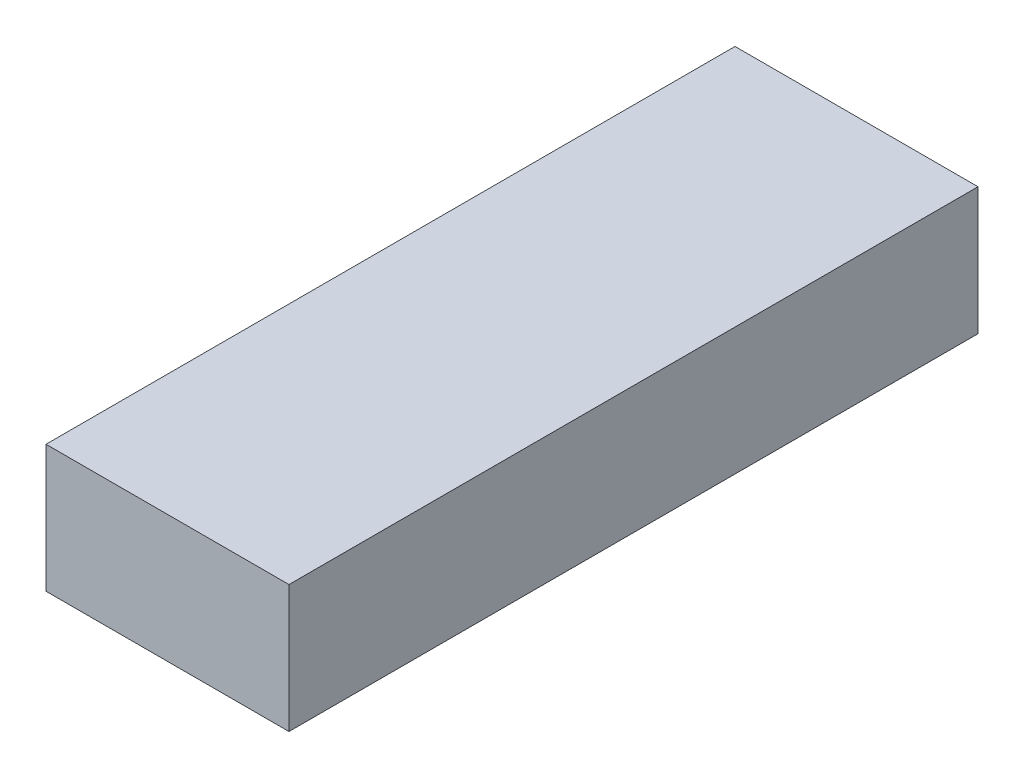
ISO-10303-21;
HEADER;
FILE_DESCRIPTION(('STEP AP214'),'2;1');
FILE_NAME('part.step','',(''),(''),'','','');
FILE_SCHEMA(('AUTOMOTIVE_DESIGN { 1 0 10303 214 1 1 1 1 }'));
ENDSEC;
DATA;
#1=APPLICATION_CONTEXT('core data for automotive mechanical design processes');
#2=APPLICATION_PROTOCOL_DEFINITION('international standard','automotive_design',2000,#1);
#3=PRODUCT_CONTEXT('',#1,'mechanical');
#4=PRODUCT('Part','Part','',(#3));
#5=PRODUCT_RELATED_PRODUCT_CATEGORY('part','',(#4));
#6=PRODUCT_DEFINITION_FORMATION('','',#4);
#7=PRODUCT_DEFINITION_CONTEXT('part definition',#1,'design');
#8=PRODUCT_DEFINITION('design','',#6,#7);
#9=PRODUCT_DEFINITION_SHAPE('','',#8);
#10=(LENGTH_UNIT() NAMED_UNIT(*) SI_UNIT(.MILLI.,.METRE.));
#11=(NAMED_UNIT(*) PLANE_ANGLE_UNIT() SI_UNIT($,.RADIAN.));
#12=(NAMED_UNIT(*) SI_UNIT($,.STERADIAN.) SOLID_ANGLE_UNIT());
#13=UNCERTAINTY_MEASURE_WITH_UNIT(LENGTH_MEASURE(1.E-05),#10,'distance_accuracy_value','');
#14=(GEOMETRIC_REPRESENTATION_CONTEXT(3) GLOBAL_UNCERTAINTY_ASSIGNED_CONTEXT((#13)) GLOBAL_UNIT_ASSIGNED_CONTEXT((#10,
#11,#12)) REPRESENTATION_CONTEXT('',''));
#15=CARTESIAN_POINT('',(0.,0.,0.));
#16=DIRECTION('',(0.,0.,1.));
#17=DIRECTION('',(1.,0.,0.));
#18=AXIS2_PLACEMENT_3D('',#15,#16,#17);
#19=CARTESIAN_POINT('',(292.,306.,828.));
#20=DIRECTION('',(-1.,0.,0.));
#21=DIRECTION('',(0.,0.,1.));
#22=AXIS2_PLACEMENT_3D('',#19,#20,#21);
#23=PLANE('',#22);
#24=DIRECTION('',(0.,0.,-1.));
#25=VECTOR('',#24,1.);
#26=CARTESIAN_POINT('',(292.,0.,828.));
#27=LINE('',#26,#25);
#28=CARTESIAN_POINT('',(292.,0.,828.));
#29=VERTEX_POINT('',#28);
#30=CARTESIAN_POINT('',(292.,0.,-828.));
#31=VERTEX_POINT('',#30);
#32=EDGE_CURVE('E101',#29,#31,#27,.T.);
#33=ORIENTED_EDGE('',*,*,#32,.T.);
#34=DIRECTION('',(0.,-1.,0.));
#35=VECTOR('',#34,1.);
#36=CARTESIAN_POINT('',(292.,306.,-828.));
#37=LINE('',#36,#35);
#38=CARTESIAN_POINT('',(292.,306.,-828.));
#39=VERTEX_POINT('',#38);
#40=EDGE_CURVE('E11',#39,#31,#37,.T.);
#41=ORIENTED_EDGE('',*,*,#40,.F.);
#42=DIRECTION('',(0.,0.,-1.));
#43=VECTOR('',#42,1.);
#44=CARTESIAN_POINT('',(292.,306.,828.));
#45=LINE('',#44,#43);
#46=CARTESIAN_POINT('',(292.,306.,828.));
#47=VERTEX_POINT('',#46);
#48=EDGE_CURVE('E89',#47,#39,#45,.T.);
#49=ORIENTED_EDGE('',*,*,#48,.F.);
#50=DIRECTION('',(0.,-1.,0.));
#51=VECTOR('',#50,1.);
#52=CARTESIAN_POINT('',(292.,306.,828.));
#53=LINE('',#52,#51);
#54=EDGE_CURVE('E97',#47,#29,#53,.T.);
#55=ORIENTED_EDGE('',*,*,#54,.T.);
#56=EDGE_LOOP('',(#33,#41,#49,#55));
#57=FACE_BOUND('',#56,.T.);
#58=ADVANCED_FACE('F38',(#57),#23,.F.);
#59=CARTESIAN_POINT('',(-292.,306.,-828.));
#60=DIRECTION('',(0.,0.,1.));
#61=DIRECTION('',(1.,0.,0.));
#62=AXIS2_PLACEMENT_3D('',#59,#60,#61);
#63=PLANE('',#62);
#64=DIRECTION('',(-1.,0.,0.));
#65=VECTOR('',#64,1.);
#66=CARTESIAN_POINT('',(-292.,0.,-828.));
#67=LINE('',#66,#65);
#68=CARTESIAN_POINT('',(-292.,0.,-828.));
#69=VERTEX_POINT('',#68);
#70=EDGE_CURVE('E93',#31,#69,#67,.T.);
#71=ORIENTED_EDGE('',*,*,#70,.T.);
#72=DIRECTION('',(0.,-1.,0.));
#73=VECTOR('',#72,1.);
#74=CARTESIAN_POINT('',(-292.,306.,-828.));
#75=LINE('',#74,#73);
#76=CARTESIAN_POINT('',(-292.,306.,-828.));
#77=VERTEX_POINT('',#76);
#78=EDGE_CURVE('E46',#77,#69,#75,.T.);
#79=ORIENTED_EDGE('',*,*,#78,.F.);
#80=DIRECTION('',(-1.,0.,0.));
#81=VECTOR('',#80,1.);
#82=CARTESIAN_POINT('',(-292.,306.,-828.));
#83=LINE('',#82,#81);
#84=EDGE_CURVE('E84',#39,#77,#83,.T.);
#85=ORIENTED_EDGE('',*,*,#84,.F.);
#86=ORIENTED_EDGE('',*,*,#40,.T.);
#87=EDGE_LOOP('',(#71,#79,#85,#86));
#88=FACE_BOUND('',#87,.T.);
#89=ADVANCED_FACE('F92',(#88),#63,.F.);
#90=CARTESIAN_POINT('',(-292.,306.,828.));
#91=DIRECTION('',(1.,0.,0.));
#92=DIRECTION('',(0.,0.,-1.));
#93=AXIS2_PLACEMENT_3D('',#90,#91,#92);
#94=PLANE('',#93);
#95=DIRECTION('',(0.,0.,1.));
#96=VECTOR('',#95,1.);
#97=CARTESIAN_POINT('',(-292.,0.,828.));
#98=LINE('',#97,#96);
#99=CARTESIAN_POINT('',(-292.,0.,828.));
#100=VERTEX_POINT('',#99);
#101=EDGE_CURVE('E71',#69,#100,#98,.T.);
#102=ORIENTED_EDGE('',*,*,#101,.T.);
#103=DIRECTION('',(0.,-1.,0.));
#104=VECTOR('',#103,1.);
#105=CARTESIAN_POINT('',(-292.,306.,828.));
#106=LINE('',#105,#104);
#107=CARTESIAN_POINT('',(-292.,306.,828.));
#108=VERTEX_POINT('',#107);
#109=EDGE_CURVE('E94',#108,#100,#106,.T.);
#110=ORIENTED_EDGE('',*,*,#109,.F.);
#111=DIRECTION('',(0.,0.,1.));
#112=VECTOR('',#111,1.);
#113=CARTESIAN_POINT('',(-292.,306.,828.));
#114=LINE('',#113,#112);
#115=EDGE_CURVE('E87',#77,#108,#114,.T.);
#116=ORIENTED_EDGE('',*,*,#115,.F.);
#117=ORIENTED_EDGE('',*,*,#78,.T.);
#118=EDGE_LOOP('',(#102,#110,#116,#117));
#119=FACE_BOUND('',#118,.T.);
#120=ADVANCED_FACE('F95',(#119),#94,.F.);
#121=CARTESIAN_POINT('',(-292.,306.,828.));
#122=DIRECTION('',(0.,0.,-1.));
#123=DIRECTION('',(-1.,0.,0.));
#124=AXIS2_PLACEMENT_3D('',#121,#122,#123);
#125=PLANE('',#124);
#126=DIRECTION('',(1.,0.,0.));
#127=VECTOR('',#126,1.);
#128=CARTESIAN_POINT('',(-292.,0.,828.));
#129=LINE('',#128,#127);
#130=EDGE_CURVE('E77',#100,#29,#129,.T.);
#131=ORIENTED_EDGE('',*,*,#130,.T.);
#132=ORIENTED_EDGE('',*,*,#54,.F.);
#133=DIRECTION('',(1.,0.,0.));
#134=VECTOR('',#133,1.);
#135=CARTESIAN_POINT('',(-292.,306.,828.));
#136=LINE('',#135,#134);
#137=EDGE_CURVE('E54',#108,#47,#136,.T.);
#138=ORIENTED_EDGE('',*,*,#137,.F.);
#139=ORIENTED_EDGE('',*,*,#109,.T.);
#140=EDGE_LOOP('',(#131,#132,#138,#139));
#141=FACE_BOUND('',#140,.T.);
#142=ADVANCED_FACE('F108',(#141),#125,.F.);
#143=CARTESIAN_POINT('',(0.,306.,0.));
#144=DIRECTION('',(0.,-1.,0.));
#145=DIRECTION('',(0.,0.,-1.));
#146=AXIS2_PLACEMENT_3D('',#143,#144,#145);
#147=PLANE('',#146);
#148=ORIENTED_EDGE('',*,*,#48,.T.);
#149=ORIENTED_EDGE('',*,*,#84,.T.);
#150=ORIENTED_EDGE('',*,*,#115,.T.);
#151=ORIENTED_EDGE('',*,*,#137,.T.);
#152=EDGE_LOOP('',(#148,#149,#150,#151));
#153=FACE_BOUND('',#152,.T.);
#154=ADVANCED_FACE('F85',(#153),#147,.F.);
#155=CARTESIAN_POINT('',(0.,0.,0.));
#156=DIRECTION('',(0.,-1.,0.));
#157=DIRECTION('',(0.,0.,-1.));
#158=AXIS2_PLACEMENT_3D('',#155,#156,#157);
#159=PLANE('',#158);
#160=ORIENTED_EDGE('',*,*,#32,.F.);
#161=ORIENTED_EDGE('',*,*,#130,.F.);
#162=ORIENTED_EDGE('',*,*,#101,.F.);
#163=ORIENTED_EDGE('',*,*,#70,.F.);
#164=EDGE_LOOP('',(#160,#161,#162,#163));
#165=FACE_BOUND('',#164,.T.);
#166=ADVANCED_FACE('F111',(#165),#159,.T.);
#167=CLOSED_SHELL('',(#58,#89,#120,#142,#154,#166));
#168=MANIFOLD_SOLID_BREP('B2',#167);
#169=ADVANCED_BREP_SHAPE_REPRESENTATION('',(#18,#168),#14);
#170=SHAPE_DEFINITION_REPRESENTATION(#9,#169);
ENDSEC;
END-ISO-10303-21;
